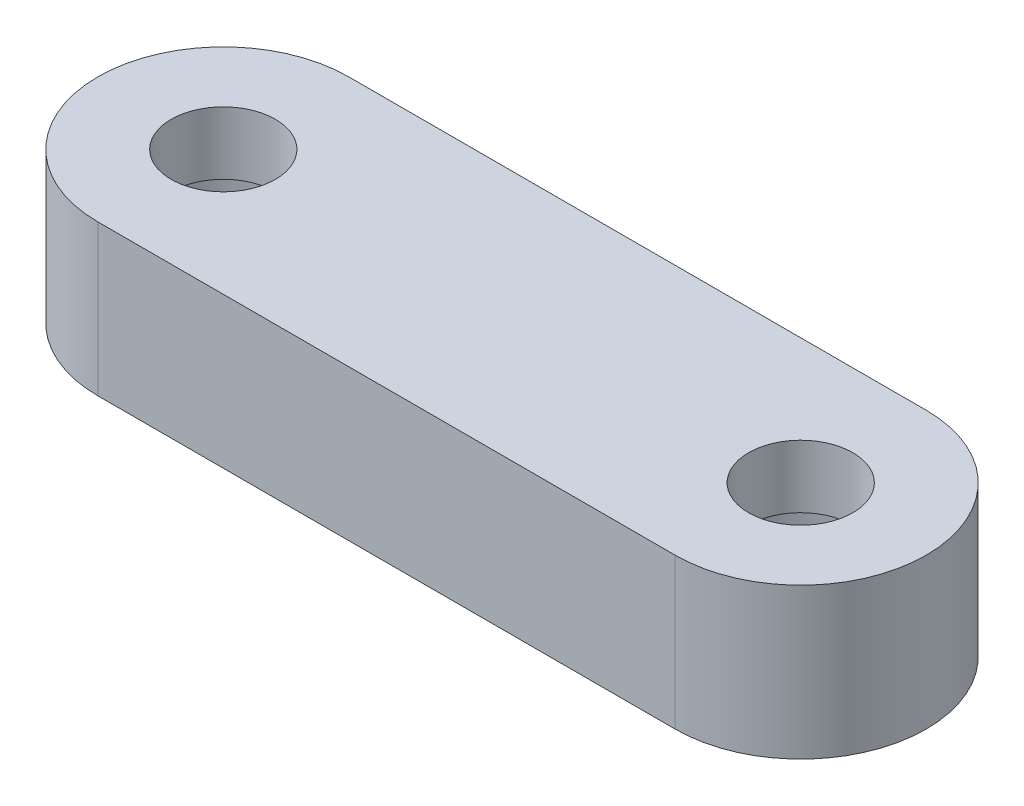
ISO-10303-21;
HEADER;
FILE_DESCRIPTION(('STEP AP214'),'2;1');
FILE_NAME('part.step','',(''),(''),'','','');
FILE_SCHEMA(('AUTOMOTIVE_DESIGN { 1 0 10303 214 1 1 1 1 }'));
ENDSEC;
DATA;
#1=APPLICATION_CONTEXT('core data for automotive mechanical design processes');
#2=APPLICATION_PROTOCOL_DEFINITION('international standard','automotive_design',2000,#1);
#3=PRODUCT_CONTEXT('',#1,'mechanical');
#4=PRODUCT('Part','Part','',(#3));
#5=PRODUCT_RELATED_PRODUCT_CATEGORY('part','',(#4));
#6=PRODUCT_DEFINITION_FORMATION('','',#4);
#7=PRODUCT_DEFINITION_CONTEXT('part definition',#1,'design');
#8=PRODUCT_DEFINITION('design','',#6,#7);
#9=PRODUCT_DEFINITION_SHAPE('','',#8);
#10=(LENGTH_UNIT() NAMED_UNIT(*) SI_UNIT(.MILLI.,.METRE.));
#11=(NAMED_UNIT(*) PLANE_ANGLE_UNIT() SI_UNIT($,.RADIAN.));
#12=(NAMED_UNIT(*) SI_UNIT($,.STERADIAN.) SOLID_ANGLE_UNIT());
#13=UNCERTAINTY_MEASURE_WITH_UNIT(LENGTH_MEASURE(1.E-05),#10,'distance_accuracy_value','');
#14=(GEOMETRIC_REPRESENTATION_CONTEXT(3) GLOBAL_UNCERTAINTY_ASSIGNED_CONTEXT((#13)) GLOBAL_UNIT_ASSIGNED_CONTEXT((#10,
#11,#12)) REPRESENTATION_CONTEXT('',''));
#15=CARTESIAN_POINT('',(0.,0.,0.));
#16=DIRECTION('',(0.,0.,1.));
#17=DIRECTION('',(1.,0.,0.));
#18=AXIS2_PLACEMENT_3D('',#15,#16,#17);
#19=CARTESIAN_POINT('',(0.,6.,0.));
#20=DIRECTION('',(0.,-1.,0.));
#21=DIRECTION('',(0.,0.,-1.));
#22=AXIS2_PLACEMENT_3D('',#19,#20,#21);
#23=CYLINDRICAL_SURFACE('',#22,5.);
#24=CARTESIAN_POINT('',(0.,0.,0.));
#25=DIRECTION('',(0.,1.,0.));
#26=DIRECTION('',(0.,0.,1.));
#27=AXIS2_PLACEMENT_3D('',#24,#25,#26);
#28=CIRCLE('',#27,5.);
#29=CARTESIAN_POINT('',(0.,0.,-5.));
#30=VERTEX_POINT('',#29);
#31=CARTESIAN_POINT('',(0.,0.,5.));
#32=VERTEX_POINT('',#31);
#33=EDGE_CURVE('E102',#30,#32,#28,.T.);
#34=ORIENTED_EDGE('',*,*,#33,.T.);
#35=DIRECTION('',(0.,-1.,0.));
#36=VECTOR('',#35,1.);
#37=CARTESIAN_POINT('',(0.,6.,5.));
#38=LINE('',#37,#36);
#39=CARTESIAN_POINT('',(0.,6.,5.));
#40=VERTEX_POINT('',#39);
#41=EDGE_CURVE('E11',#40,#32,#38,.T.);
#42=ORIENTED_EDGE('',*,*,#41,.F.);
#43=CARTESIAN_POINT('',(0.,6.,0.));
#44=DIRECTION('',(0.,1.,0.));
#45=DIRECTION('',(0.,0.,1.));
#46=AXIS2_PLACEMENT_3D('',#43,#44,#45);
#47=CIRCLE('',#46,5.);
#48=CARTESIAN_POINT('',(0.,6.,-5.));
#49=VERTEX_POINT('',#48);
#50=EDGE_CURVE('E90',#49,#40,#47,.T.);
#51=ORIENTED_EDGE('',*,*,#50,.F.);
#52=DIRECTION('',(0.,-1.,0.));
#53=VECTOR('',#52,1.);
#54=CARTESIAN_POINT('',(0.,6.,-5.));
#55=LINE('',#54,#53);
#56=EDGE_CURVE('E98',#49,#30,#55,.T.);
#57=ORIENTED_EDGE('',*,*,#56,.T.);
#58=EDGE_LOOP('',(#34,#42,#51,#57));
#59=FACE_BOUND('',#58,.T.);
#60=ADVANCED_FACE('F39',(#59),#23,.T.);
#61=CARTESIAN_POINT('',(0.,6.,5.));
#62=DIRECTION('',(0.,0.,-1.));
#63=DIRECTION('',(-1.,0.,0.));
#64=AXIS2_PLACEMENT_3D('',#61,#62,#63);
#65=PLANE('',#64);
#66=DIRECTION('',(1.,0.,0.));
#67=VECTOR('',#66,1.);
#68=CARTESIAN_POINT('',(0.,0.,5.));
#69=LINE('',#68,#67);
#70=CARTESIAN_POINT('',(23.,0.,5.));
#71=VERTEX_POINT('',#70);
#72=EDGE_CURVE('E94',#32,#71,#69,.T.);
#73=ORIENTED_EDGE('',*,*,#72,.T.);
#74=DIRECTION('',(0.,-1.,0.));
#75=VECTOR('',#74,1.);
#76=CARTESIAN_POINT('',(23.,6.,5.));
#77=LINE('',#76,#75);
#78=CARTESIAN_POINT('',(23.,6.,5.));
#79=VERTEX_POINT('',#78);
#80=EDGE_CURVE('E47',#79,#71,#77,.T.);
#81=ORIENTED_EDGE('',*,*,#80,.F.);
#82=DIRECTION('',(1.,0.,0.));
#83=VECTOR('',#82,1.);
#84=CARTESIAN_POINT('',(0.,6.,5.));
#85=LINE('',#84,#83);
#86=EDGE_CURVE('E85',#40,#79,#85,.T.);
#87=ORIENTED_EDGE('',*,*,#86,.F.);
#88=ORIENTED_EDGE('',*,*,#41,.T.);
#89=EDGE_LOOP('',(#73,#81,#87,#88));
#90=FACE_BOUND('',#89,.T.);
#91=ADVANCED_FACE('F93',(#90),#65,.F.);
#92=CARTESIAN_POINT('',(23.,6.,0.));
#93=DIRECTION('',(0.,-1.,0.));
#94=DIRECTION('',(0.,0.,-1.));
#95=AXIS2_PLACEMENT_3D('',#92,#93,#94);
#96=CYLINDRICAL_SURFACE('',#95,5.);
#97=CARTESIAN_POINT('',(23.,0.,0.));
#98=DIRECTION('',(0.,1.,0.));
#99=DIRECTION('',(0.,0.,1.));
#100=AXIS2_PLACEMENT_3D('',#97,#98,#99);
#101=CIRCLE('',#100,5.);
#102=CARTESIAN_POINT('',(23.,0.,-5.));
#103=VERTEX_POINT('',#102);
#104=EDGE_CURVE('E72',#71,#103,#101,.T.);
#105=ORIENTED_EDGE('',*,*,#104,.T.);
#106=DIRECTION('',(0.,-1.,0.));
#107=VECTOR('',#106,1.);
#108=CARTESIAN_POINT('',(23.,6.,-5.));
#109=LINE('',#108,#107);
#110=CARTESIAN_POINT('',(23.,6.,-5.));
#111=VERTEX_POINT('',#110);
#112=EDGE_CURVE('E95',#111,#103,#109,.T.);
#113=ORIENTED_EDGE('',*,*,#112,.F.);
#114=CARTESIAN_POINT('',(23.,6.,0.));
#115=DIRECTION('',(0.,1.,0.));
#116=DIRECTION('',(0.,0.,1.));
#117=AXIS2_PLACEMENT_3D('',#114,#115,#116);
#118=CIRCLE('',#117,5.);
#119=EDGE_CURVE('E88',#79,#111,#118,.T.);
#120=ORIENTED_EDGE('',*,*,#119,.F.);
#121=ORIENTED_EDGE('',*,*,#80,.T.);
#122=EDGE_LOOP('',(#105,#113,#120,#121));
#123=FACE_BOUND('',#122,.T.);
#124=ADVANCED_FACE('F96',(#123),#96,.T.);
#125=CARTESIAN_POINT('',(0.,6.,-5.));
#126=DIRECTION('',(0.,0.,1.));
#127=DIRECTION('',(1.,0.,0.));
#128=AXIS2_PLACEMENT_3D('',#125,#126,#127);
#129=PLANE('',#128);
#130=DIRECTION('',(-1.,0.,0.));
#131=VECTOR('',#130,1.);
#132=CARTESIAN_POINT('',(0.,0.,-5.));
#133=LINE('',#132,#131);
#134=EDGE_CURVE('E78',#103,#30,#133,.T.);
#135=ORIENTED_EDGE('',*,*,#134,.T.);
#136=ORIENTED_EDGE('',*,*,#56,.F.);
#137=DIRECTION('',(-1.,0.,0.));
#138=VECTOR('',#137,1.);
#139=CARTESIAN_POINT('',(0.,6.,-5.));
#140=LINE('',#139,#138);
#141=EDGE_CURVE('E55',#111,#49,#140,.T.);
#142=ORIENTED_EDGE('',*,*,#141,.F.);
#143=ORIENTED_EDGE('',*,*,#112,.T.);
#144=EDGE_LOOP('',(#135,#136,#142,#143));
#145=FACE_BOUND('',#144,.T.);
#146=ADVANCED_FACE('F110',(#145),#129,.F.);
#147=CARTESIAN_POINT('',(0.,6.,0.));
#148=DIRECTION('',(0.,1.,0.));
#149=DIRECTION('',(0.,0.,1.));
#150=AXIS2_PLACEMENT_3D('',#147,#148,#149);
#151=PLANE('',#150);
#152=CARTESIAN_POINT('',(23.,6.,0.));
#153=DIRECTION('',(0.,1.,0.));
#154=DIRECTION('',(0.,0.,1.));
#155=AXIS2_PLACEMENT_3D('',#152,#153,#154);
#156=CIRCLE('',#155,2.075);
#157=CARTESIAN_POINT('',(23.,6.,2.075));
#158=VERTEX_POINT('',#157);
#159=EDGE_CURVE('E136',#158,#158,#156,.T.);
#160=ORIENTED_EDGE('',*,*,#159,.F.);
#161=EDGE_LOOP('',(#160));
#162=FACE_BOUND('',#161,.T.);
#163=CARTESIAN_POINT('',(0.,6.,0.));
#164=DIRECTION('',(0.,-1.,0.));
#165=DIRECTION('',(0.,0.,-1.));
#166=AXIS2_PLACEMENT_3D('',#163,#164,#165);
#167=CIRCLE('',#166,2.075);
#168=CARTESIAN_POINT('',(0.,6.,-2.075));
#169=VERTEX_POINT('',#168);
#170=EDGE_CURVE('E124',#169,#169,#167,.T.);
#171=ORIENTED_EDGE('',*,*,#170,.T.);
#172=EDGE_LOOP('',(#171));
#173=FACE_BOUND('',#172,.T.);
#174=ORIENTED_EDGE('',*,*,#50,.T.);
#175=ORIENTED_EDGE('',*,*,#86,.T.);
#176=ORIENTED_EDGE('',*,*,#119,.T.);
#177=ORIENTED_EDGE('',*,*,#141,.T.);
#178=EDGE_LOOP('',(#174,#175,#176,#177));
#179=FACE_BOUND('',#178,.T.);
#180=ADVANCED_FACE('F86',(#162,#173,#179),#151,.T.);
#181=CARTESIAN_POINT('',(0.,0.,0.));
#182=DIRECTION('',(0.,1.,0.));
#183=DIRECTION('',(0.,0.,1.));
#184=AXIS2_PLACEMENT_3D('',#181,#182,#183);
#185=PLANE('',#184);
#186=CARTESIAN_POINT('',(23.,0.,0.));
#187=DIRECTION('',(0.,1.,0.));
#188=DIRECTION('',(0.,0.,1.));
#189=AXIS2_PLACEMENT_3D('',#186,#187,#188);
#190=CIRCLE('',#189,3.75);
#191=CARTESIAN_POINT('',(23.,0.,3.75));
#192=VERTEX_POINT('',#191);
#193=EDGE_CURVE('E127',#192,#192,#190,.T.);
#194=ORIENTED_EDGE('',*,*,#193,.T.);
#195=EDGE_LOOP('',(#194));
#196=FACE_BOUND('',#195,.T.);
#197=CARTESIAN_POINT('',(0.,0.,0.));
#198=DIRECTION('',(0.,-1.,0.));
#199=DIRECTION('',(0.,0.,-1.));
#200=AXIS2_PLACEMENT_3D('',#197,#198,#199);
#201=CIRCLE('',#200,3.75);
#202=CARTESIAN_POINT('',(0.,0.,-3.75));
#203=VERTEX_POINT('',#202);
#204=EDGE_CURVE('E105',#203,#203,#201,.T.);
#205=ORIENTED_EDGE('',*,*,#204,.F.);
#206=EDGE_LOOP('',(#205));
#207=FACE_BOUND('',#206,.T.);
#208=ORIENTED_EDGE('',*,*,#33,.F.);
#209=ORIENTED_EDGE('',*,*,#134,.F.);
#210=ORIENTED_EDGE('',*,*,#104,.F.);
#211=ORIENTED_EDGE('',*,*,#72,.F.);
#212=EDGE_LOOP('',(#208,#209,#210,#211));
#213=FACE_BOUND('',#212,.T.);
#214=ADVANCED_FACE('F113',(#196,#207,#213),#185,.F.);
#215=CARTESIAN_POINT('',(0.,0.,0.));
#216=DIRECTION('',(0.,-1.,0.));
#217=DIRECTION('',(0.,0.,-1.));
#218=AXIS2_PLACEMENT_3D('',#215,#216,#217);
#219=CYLINDRICAL_SURFACE('',#218,3.75);
#220=ORIENTED_EDGE('',*,*,#204,.T.);
#221=EDGE_LOOP('',(#220));
#222=FACE_BOUND('',#221,.T.);
#223=CARTESIAN_POINT('',(0.,3.5,0.));
#224=DIRECTION('',(0.,-1.,0.));
#225=DIRECTION('',(0.,0.,-1.));
#226=AXIS2_PLACEMENT_3D('',#223,#224,#225);
#227=CIRCLE('',#226,3.75);
#228=CARTESIAN_POINT('',(0.,3.5,-3.75));
#229=VERTEX_POINT('',#228);
#230=EDGE_CURVE('E118',#229,#229,#227,.T.);
#231=ORIENTED_EDGE('',*,*,#230,.F.);
#232=EDGE_LOOP('',(#231));
#233=FACE_BOUND('',#232,.T.);
#234=ADVANCED_FACE('F160',(#222,#233),#219,.F.);
#235=CARTESIAN_POINT('',(-3.75,3.5,0.));
#236=DIRECTION('',(0.,-1.,0.));
#237=DIRECTION('',(0.,0.,-1.));
#238=AXIS2_PLACEMENT_3D('',#235,#236,#237);
#239=PLANE('',#238);
#240=ORIENTED_EDGE('',*,*,#230,.T.);
#241=EDGE_LOOP('',(#240));
#242=FACE_BOUND('',#241,.T.);
#243=CARTESIAN_POINT('',(0.,3.5,0.));
#244=DIRECTION('',(0.,-1.,0.));
#245=DIRECTION('',(0.,0.,-1.));
#246=AXIS2_PLACEMENT_3D('',#243,#244,#245);
#247=CIRCLE('',#246,2.075);
#248=CARTESIAN_POINT('',(0.,3.5,-2.075));
#249=VERTEX_POINT('',#248);
#250=EDGE_CURVE('E121',#249,#249,#247,.T.);
#251=ORIENTED_EDGE('',*,*,#250,.F.);
#252=EDGE_LOOP('',(#251));
#253=FACE_BOUND('',#252,.T.);
#254=ADVANCED_FACE('F150',(#242,#253),#239,.T.);
#255=CARTESIAN_POINT('',(0.,0.,0.));
#256=DIRECTION('',(0.,-1.,0.));
#257=DIRECTION('',(0.,0.,-1.));
#258=AXIS2_PLACEMENT_3D('',#255,#256,#257);
#259=CYLINDRICAL_SURFACE('',#258,2.075);
#260=ORIENTED_EDGE('',*,*,#250,.T.);
#261=EDGE_LOOP('',(#260));
#262=FACE_BOUND('',#261,.T.);
#263=ORIENTED_EDGE('',*,*,#170,.F.);
#264=EDGE_LOOP('',(#263));
#265=FACE_BOUND('',#264,.T.);
#266=ADVANCED_FACE('F147',(#262,#265),#259,.F.);
#267=CARTESIAN_POINT('',(23.,6.,0.));
#268=DIRECTION('',(0.,1.,0.));
#269=DIRECTION('',(0.,0.,1.));
#270=AXIS2_PLACEMENT_3D('',#267,#268,#269);
#271=CYLINDRICAL_SURFACE('',#270,3.75);
#272=ORIENTED_EDGE('',*,*,#193,.F.);
#273=EDGE_LOOP('',(#272));
#274=FACE_BOUND('',#273,.T.);
#275=CARTESIAN_POINT('',(23.,3.5,0.));
#276=DIRECTION('',(0.,1.,0.));
#277=DIRECTION('',(0.,0.,1.));
#278=AXIS2_PLACEMENT_3D('',#275,#276,#277);
#279=CIRCLE('',#278,3.75);
#280=CARTESIAN_POINT('',(23.,3.5,3.75));
#281=VERTEX_POINT('',#280);
#282=EDGE_CURVE('E130',#281,#281,#279,.T.);
#283=ORIENTED_EDGE('',*,*,#282,.T.);
#284=EDGE_LOOP('',(#283));
#285=FACE_BOUND('',#284,.T.);
#286=ADVANCED_FACE('F149',(#274,#285),#271,.F.);
#287=CARTESIAN_POINT('',(19.25,3.5,0.));
#288=DIRECTION('',(0.,1.,0.));
#289=DIRECTION('',(0.,0.,1.));
#290=AXIS2_PLACEMENT_3D('',#287,#288,#289);
#291=PLANE('',#290);
#292=ORIENTED_EDGE('',*,*,#282,.F.);
#293=EDGE_LOOP('',(#292));
#294=FACE_BOUND('',#293,.T.);
#295=CARTESIAN_POINT('',(23.,3.5,0.));
#296=DIRECTION('',(0.,1.,0.));
#297=DIRECTION('',(0.,0.,1.));
#298=AXIS2_PLACEMENT_3D('',#295,#296,#297);
#299=CIRCLE('',#298,2.075);
#300=CARTESIAN_POINT('',(23.,3.5,2.075));
#301=VERTEX_POINT('',#300);
#302=EDGE_CURVE('E133',#301,#301,#299,.T.);
#303=ORIENTED_EDGE('',*,*,#302,.T.);
#304=EDGE_LOOP('',(#303));
#305=FACE_BOUND('',#304,.T.);
#306=ADVANCED_FACE('F157',(#294,#305),#291,.F.);
#307=CARTESIAN_POINT('',(23.,6.,0.));
#308=DIRECTION('',(0.,1.,0.));
#309=DIRECTION('',(0.,0.,1.));
#310=AXIS2_PLACEMENT_3D('',#307,#308,#309);
#311=CYLINDRICAL_SURFACE('',#310,2.075);
#312=ORIENTED_EDGE('',*,*,#302,.F.);
#313=EDGE_LOOP('',(#312));
#314=FACE_BOUND('',#313,.T.);
#315=ORIENTED_EDGE('',*,*,#159,.T.);
#316=EDGE_LOOP('',(#315));
#317=FACE_BOUND('',#316,.T.);
#318=ADVANCED_FACE('F140',(#314,#317),#311,.F.);
#319=CLOSED_SHELL('',(#60,#91,#124,#146,#180,#214,#234,#254,#266,#286,#306,#318));
#320=MANIFOLD_SOLID_BREP('B2',#319);
#321=ADVANCED_BREP_SHAPE_REPRESENTATION('',(#18,#320),#14);
#322=SHAPE_DEFINITION_REPRESENTATION(#9,#321);
ENDSEC;
END-ISO-10303-21;
